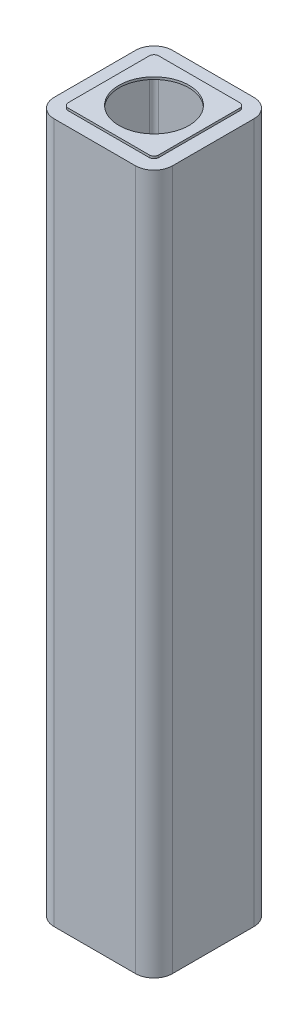
ISO-10303-21;
HEADER;
FILE_DESCRIPTION(('STEP AP214'),'2;1');
FILE_NAME('part.step','',(''),(''),'','','');
FILE_SCHEMA(('AUTOMOTIVE_DESIGN { 1 0 10303 214 1 1 1 1 }'));
ENDSEC;
DATA;
#1=APPLICATION_CONTEXT('core data for automotive mechanical design processes');
#2=APPLICATION_PROTOCOL_DEFINITION('international standard','automotive_design',2000,#1);
#3=PRODUCT_CONTEXT('',#1,'mechanical');
#4=PRODUCT('Part','Part','',(#3));
#5=PRODUCT_RELATED_PRODUCT_CATEGORY('part','',(#4));
#6=PRODUCT_DEFINITION_FORMATION('','',#4);
#7=PRODUCT_DEFINITION_CONTEXT('part definition',#1,'design');
#8=PRODUCT_DEFINITION('design','',#6,#7);
#9=PRODUCT_DEFINITION_SHAPE('','',#8);
#10=(LENGTH_UNIT() NAMED_UNIT(*) SI_UNIT(.MILLI.,.METRE.));
#11=(NAMED_UNIT(*) PLANE_ANGLE_UNIT() SI_UNIT($,.RADIAN.));
#12=(NAMED_UNIT(*) SI_UNIT($,.STERADIAN.) SOLID_ANGLE_UNIT());
#13=UNCERTAINTY_MEASURE_WITH_UNIT(LENGTH_MEASURE(1.E-05),#10,'distance_accuracy_value','');
#14=(GEOMETRIC_REPRESENTATION_CONTEXT(3) GLOBAL_UNCERTAINTY_ASSIGNED_CONTEXT((#13)) GLOBAL_UNIT_ASSIGNED_CONTEXT((#10,
#11,#12)) REPRESENTATION_CONTEXT('',''));
#15=CARTESIAN_POINT('',(0.,0.,0.));
#16=DIRECTION('',(0.,0.,1.));
#17=DIRECTION('',(1.,0.,0.));
#18=AXIS2_PLACEMENT_3D('',#15,#16,#17);
#19=CARTESIAN_POINT('',(8.7,150.5,-8.7));
#20=DIRECTION('',(0.,1.,0.));
#21=DIRECTION('',(0.,0.,1.));
#22=AXIS2_PLACEMENT_3D('',#19,#20,#21);
#23=PLANE('',#22);
#24=CARTESIAN_POINT('',(8.7,150.5,-8.7));
#25=DIRECTION('',(0.,1.,0.));
#26=DIRECTION('',(0.,0.,1.));
#27=AXIS2_PLACEMENT_3D('',#24,#25,#26);
#28=CIRCLE('',#27,1.00000000000001);
#29=CARTESIAN_POINT('',(9.7,150.5,-8.7));
#30=VERTEX_POINT('',#29);
#31=CARTESIAN_POINT('',(8.7,150.5,-9.7));
#32=VERTEX_POINT('',#31);
#33=EDGE_CURVE('E189',#30,#32,#28,.T.);
#34=ORIENTED_EDGE('',*,*,#33,.T.);
#35=DIRECTION('',(-1.,0.,0.));
#36=VECTOR('',#35,1.);
#37=CARTESIAN_POINT('',(8.7,150.5,-9.7));
#38=LINE('',#37,#36);
#39=CARTESIAN_POINT('',(-8.7,150.5,-9.7));
#40=VERTEX_POINT('',#39);
#41=EDGE_CURVE('E137',#32,#40,#38,.T.);
#42=ORIENTED_EDGE('',*,*,#41,.T.);
#43=CARTESIAN_POINT('',(-8.7,150.5,-8.7));
#44=DIRECTION('',(0.,1.,0.));
#45=DIRECTION('',(0.,0.,1.));
#46=AXIS2_PLACEMENT_3D('',#43,#44,#45);
#47=CIRCLE('',#46,1.);
#48=CARTESIAN_POINT('',(-9.7,150.5,-8.7));
#49=VERTEX_POINT('',#48);
#50=EDGE_CURVE('E204',#40,#49,#47,.T.);
#51=ORIENTED_EDGE('',*,*,#50,.T.);
#52=DIRECTION('',(0.,0.,1.));
#53=VECTOR('',#52,1.);
#54=CARTESIAN_POINT('',(-9.7,150.5,-8.7));
#55=LINE('',#54,#53);
#56=CARTESIAN_POINT('',(-9.7,150.5,8.7));
#57=VERTEX_POINT('',#56);
#58=EDGE_CURVE('E217',#49,#57,#55,.T.);
#59=ORIENTED_EDGE('',*,*,#58,.T.);
#60=CARTESIAN_POINT('',(-8.7,150.5,8.7));
#61=DIRECTION('',(0.,1.,0.));
#62=DIRECTION('',(0.,0.,1.));
#63=AXIS2_PLACEMENT_3D('',#60,#61,#62);
#64=CIRCLE('',#63,1.);
#65=CARTESIAN_POINT('',(-8.7,150.5,9.7));
#66=VERTEX_POINT('',#65);
#67=EDGE_CURVE('E156',#57,#66,#64,.T.);
#68=ORIENTED_EDGE('',*,*,#67,.T.);
#69=DIRECTION('',(1.,0.,0.));
#70=VECTOR('',#69,1.);
#71=CARTESIAN_POINT('',(-8.7,150.5,9.7));
#72=LINE('',#71,#70);
#73=CARTESIAN_POINT('',(8.7,150.5,9.7));
#74=VERTEX_POINT('',#73);
#75=EDGE_CURVE('E150',#66,#74,#72,.T.);
#76=ORIENTED_EDGE('',*,*,#75,.T.);
#77=CARTESIAN_POINT('',(8.7,150.5,8.7));
#78=DIRECTION('',(0.,1.,0.));
#79=DIRECTION('',(0.,0.,1.));
#80=AXIS2_PLACEMENT_3D('',#77,#78,#79);
#81=CIRCLE('',#80,1.);
#82=CARTESIAN_POINT('',(9.7,150.5,8.7));
#83=VERTEX_POINT('',#82);
#84=EDGE_CURVE('E154',#74,#83,#81,.T.);
#85=ORIENTED_EDGE('',*,*,#84,.T.);
#86=DIRECTION('',(0.,0.,-1.));
#87=VECTOR('',#86,1.);
#88=CARTESIAN_POINT('',(9.7,150.5,8.7));
#89=LINE('',#88,#87);
#90=EDGE_CURVE('E94',#83,#30,#89,.T.);
#91=ORIENTED_EDGE('',*,*,#90,.T.);
#92=EDGE_LOOP('',(#34,#42,#51,#59,#68,#76,#85,#91));
#93=FACE_BOUND('',#92,.T.);
#94=CARTESIAN_POINT('',(0.,150.5,0.));
#95=DIRECTION('',(0.,1.,0.));
#96=DIRECTION('',(0.,0.,1.));
#97=AXIS2_PLACEMENT_3D('',#94,#95,#96);
#98=CIRCLE('',#97,7.5);
#99=CARTESIAN_POINT('',(0.,150.5,7.50000000000001));
#100=VERTEX_POINT('',#99);
#101=EDGE_CURVE('E178',#100,#100,#98,.T.);
#102=ORIENTED_EDGE('',*,*,#101,.F.);
#103=EDGE_LOOP('',(#102));
#104=FACE_BOUND('',#103,.T.);
#105=ADVANCED_FACE('F77',(#93,#104),#23,.T.);
#106=CARTESIAN_POINT('',(8.7,150.,-8.7));
#107=DIRECTION('',(0.,1.,0.));
#108=DIRECTION('',(0.,0.,1.));
#109=AXIS2_PLACEMENT_3D('',#106,#107,#108);
#110=PLANE('',#109);
#111=CARTESIAN_POINT('',(8.7,150.,-8.7));
#112=DIRECTION('',(0.,1.,0.));
#113=DIRECTION('',(0.,0.,1.));
#114=AXIS2_PLACEMENT_3D('',#111,#112,#113);
#115=CIRCLE('',#114,1.00000000000001);
#116=CARTESIAN_POINT('',(9.7,150.,-8.7));
#117=VERTEX_POINT('',#116);
#118=CARTESIAN_POINT('',(8.7,150.,-9.7));
#119=VERTEX_POINT('',#118);
#120=EDGE_CURVE('E174',#117,#119,#115,.T.);
#121=ORIENTED_EDGE('',*,*,#120,.F.);
#122=DIRECTION('',(0.,0.,-1.));
#123=VECTOR('',#122,1.);
#124=CARTESIAN_POINT('',(9.7,150.,8.7));
#125=LINE('',#124,#123);
#126=CARTESIAN_POINT('',(9.7,150.,8.7));
#127=VERTEX_POINT('',#126);
#128=EDGE_CURVE('E129',#127,#117,#125,.T.);
#129=ORIENTED_EDGE('',*,*,#128,.F.);
#130=CARTESIAN_POINT('',(8.7,150.,8.7));
#131=DIRECTION('',(0.,1.,0.));
#132=DIRECTION('',(0.,0.,1.));
#133=AXIS2_PLACEMENT_3D('',#130,#131,#132);
#134=CIRCLE('',#133,1.);
#135=CARTESIAN_POINT('',(8.7,150.,9.7));
#136=VERTEX_POINT('',#135);
#137=EDGE_CURVE('E123',#136,#127,#134,.T.);
#138=ORIENTED_EDGE('',*,*,#137,.F.);
#139=DIRECTION('',(1.,0.,0.));
#140=VECTOR('',#139,1.);
#141=CARTESIAN_POINT('',(-8.7,150.,9.7));
#142=LINE('',#141,#140);
#143=CARTESIAN_POINT('',(-8.7,150.,9.7));
#144=VERTEX_POINT('',#143);
#145=EDGE_CURVE('E164',#144,#136,#142,.T.);
#146=ORIENTED_EDGE('',*,*,#145,.F.);
#147=CARTESIAN_POINT('',(-8.7,150.,8.7));
#148=DIRECTION('',(0.,1.,0.));
#149=DIRECTION('',(0.,0.,1.));
#150=AXIS2_PLACEMENT_3D('',#147,#148,#149);
#151=CIRCLE('',#150,1.);
#152=CARTESIAN_POINT('',(-9.7,150.,8.7));
#153=VERTEX_POINT('',#152);
#154=EDGE_CURVE('E184',#153,#144,#151,.T.);
#155=ORIENTED_EDGE('',*,*,#154,.F.);
#156=DIRECTION('',(0.,0.,1.));
#157=VECTOR('',#156,1.);
#158=CARTESIAN_POINT('',(-9.7,150.,-8.7));
#159=LINE('',#158,#157);
#160=CARTESIAN_POINT('',(-9.7,150.,-8.7));
#161=VERTEX_POINT('',#160);
#162=EDGE_CURVE('E182',#161,#153,#159,.T.);
#163=ORIENTED_EDGE('',*,*,#162,.F.);
#164=CARTESIAN_POINT('',(-8.7,150.,-8.7));
#165=DIRECTION('',(0.,1.,0.));
#166=DIRECTION('',(0.,0.,1.));
#167=AXIS2_PLACEMENT_3D('',#164,#165,#166);
#168=CIRCLE('',#167,1.);
#169=CARTESIAN_POINT('',(-8.7,150.,-9.7));
#170=VERTEX_POINT('',#169);
#171=EDGE_CURVE('E180',#170,#161,#168,.T.);
#172=ORIENTED_EDGE('',*,*,#171,.F.);
#173=DIRECTION('',(-1.,0.,0.));
#174=VECTOR('',#173,1.);
#175=CARTESIAN_POINT('',(8.7,150.,-9.7));
#176=LINE('',#175,#174);
#177=EDGE_CURVE('E177',#119,#170,#176,.T.);
#178=ORIENTED_EDGE('',*,*,#177,.F.);
#179=EDGE_LOOP('',(#121,#129,#138,#146,#155,#163,#172,#178));
#180=FACE_BOUND('',#179,.T.);
#181=CARTESIAN_POINT('',(0.,150.,0.));
#182=DIRECTION('',(0.,1.,0.));
#183=DIRECTION('',(0.,0.,1.));
#184=AXIS2_PLACEMENT_3D('',#181,#182,#183);
#185=CIRCLE('',#184,7.5);
#186=CARTESIAN_POINT('',(0.,150.,7.50000000000001));
#187=VERTEX_POINT('',#186);
#188=EDGE_CURVE('E223',#187,#187,#185,.T.);
#189=ORIENTED_EDGE('',*,*,#188,.T.);
#190=EDGE_LOOP('',(#189));
#191=FACE_BOUND('',#190,.T.);
#192=ADVANCED_FACE('F208',(#180,#191),#110,.F.);
#193=CARTESIAN_POINT('',(8.7,150.5,-8.7));
#194=DIRECTION('',(0.,-1.,0.));
#195=DIRECTION('',(0.,0.,-1.));
#196=AXIS2_PLACEMENT_3D('',#193,#194,#195);
#197=CYLINDRICAL_SURFACE('',#196,1.00000000000001);
#198=ORIENTED_EDGE('',*,*,#120,.T.);
#199=DIRECTION('',(0.,-1.,0.));
#200=VECTOR('',#199,1.);
#201=CARTESIAN_POINT('',(8.7,150.5,-9.7));
#202=LINE('',#201,#200);
#203=EDGE_CURVE('E13',#32,#119,#202,.T.);
#204=ORIENTED_EDGE('',*,*,#203,.F.);
#205=ORIENTED_EDGE('',*,*,#33,.F.);
#206=DIRECTION('',(0.,-1.,0.));
#207=VECTOR('',#206,1.);
#208=CARTESIAN_POINT('',(9.7,150.5,-8.7));
#209=LINE('',#208,#207);
#210=EDGE_CURVE('E170',#30,#117,#209,.T.);
#211=ORIENTED_EDGE('',*,*,#210,.T.);
#212=EDGE_LOOP('',(#198,#204,#205,#211));
#213=FACE_BOUND('',#212,.T.);
#214=ADVANCED_FACE('F79',(#213),#197,.T.);
#215=CARTESIAN_POINT('',(8.7,150.5,-9.7));
#216=DIRECTION('',(0.,0.,1.));
#217=DIRECTION('',(0.,-1.,0.));
#218=AXIS2_PLACEMENT_3D('',#215,#216,#217);
#219=PLANE('',#218);
#220=ORIENTED_EDGE('',*,*,#177,.T.);
#221=DIRECTION('',(0.,-1.,0.));
#222=VECTOR('',#221,1.);
#223=CARTESIAN_POINT('',(-8.7,150.5,-9.7));
#224=LINE('',#223,#222);
#225=EDGE_CURVE('E86',#40,#170,#224,.T.);
#226=ORIENTED_EDGE('',*,*,#225,.F.);
#227=ORIENTED_EDGE('',*,*,#41,.F.);
#228=ORIENTED_EDGE('',*,*,#203,.T.);
#229=EDGE_LOOP('',(#220,#226,#227,#228));
#230=FACE_BOUND('',#229,.T.);
#231=ADVANCED_FACE('F251',(#230),#219,.F.);
#232=CARTESIAN_POINT('',(-8.7,150.5,-8.7));
#233=DIRECTION('',(0.,-1.,0.));
#234=DIRECTION('',(0.,0.,-1.));
#235=AXIS2_PLACEMENT_3D('',#232,#233,#234);
#236=CYLINDRICAL_SURFACE('',#235,1.);
#237=ORIENTED_EDGE('',*,*,#171,.T.);
#238=DIRECTION('',(0.,-1.,0.));
#239=VECTOR('',#238,1.);
#240=CARTESIAN_POINT('',(-9.7,150.5,-8.7));
#241=LINE('',#240,#239);
#242=EDGE_CURVE('E196',#49,#161,#241,.T.);
#243=ORIENTED_EDGE('',*,*,#242,.F.);
#244=ORIENTED_EDGE('',*,*,#50,.F.);
#245=ORIENTED_EDGE('',*,*,#225,.T.);
#246=EDGE_LOOP('',(#237,#243,#244,#245));
#247=FACE_BOUND('',#246,.T.);
#248=ADVANCED_FACE('F202',(#247),#236,.T.);
#249=CARTESIAN_POINT('',(-9.7,150.5,-8.7));
#250=DIRECTION('',(1.,0.,0.));
#251=DIRECTION('',(0.,0.,-1.));
#252=AXIS2_PLACEMENT_3D('',#249,#250,#251);
#253=PLANE('',#252);
#254=ORIENTED_EDGE('',*,*,#162,.T.);
#255=DIRECTION('',(0.,-1.,0.));
#256=VECTOR('',#255,1.);
#257=CARTESIAN_POINT('',(-9.7,150.5,8.7));
#258=LINE('',#257,#256);
#259=EDGE_CURVE('E193',#57,#153,#258,.T.);
#260=ORIENTED_EDGE('',*,*,#259,.F.);
#261=ORIENTED_EDGE('',*,*,#58,.F.);
#262=ORIENTED_EDGE('',*,*,#242,.T.);
#263=EDGE_LOOP('',(#254,#260,#261,#262));
#264=FACE_BOUND('',#263,.T.);
#265=ADVANCED_FACE('F213',(#264),#253,.F.);
#266=CARTESIAN_POINT('',(-8.7,150.5,8.7));
#267=DIRECTION('',(0.,-1.,0.));
#268=DIRECTION('',(0.,0.,-1.));
#269=AXIS2_PLACEMENT_3D('',#266,#267,#268);
#270=CYLINDRICAL_SURFACE('',#269,1.);
#271=ORIENTED_EDGE('',*,*,#154,.T.);
#272=DIRECTION('',(0.,-1.,0.));
#273=VECTOR('',#272,1.);
#274=CARTESIAN_POINT('',(-8.7,150.5,9.7));
#275=LINE('',#274,#273);
#276=EDGE_CURVE('E165',#66,#144,#275,.T.);
#277=ORIENTED_EDGE('',*,*,#276,.F.);
#278=ORIENTED_EDGE('',*,*,#67,.F.);
#279=ORIENTED_EDGE('',*,*,#259,.T.);
#280=EDGE_LOOP('',(#271,#277,#278,#279));
#281=FACE_BOUND('',#280,.T.);
#282=ADVANCED_FACE('F216',(#281),#270,.T.);
#283=CARTESIAN_POINT('',(-8.7,150.5,9.7));
#284=DIRECTION('',(0.,0.,-1.));
#285=DIRECTION('',(-1.,0.,0.));
#286=AXIS2_PLACEMENT_3D('',#283,#284,#285);
#287=PLANE('',#286);
#288=ORIENTED_EDGE('',*,*,#145,.T.);
#289=DIRECTION('',(0.,-1.,0.));
#290=VECTOR('',#289,1.);
#291=CARTESIAN_POINT('',(8.7,150.5,9.7));
#292=LINE('',#291,#290);
#293=EDGE_CURVE('E161',#74,#136,#292,.T.);
#294=ORIENTED_EDGE('',*,*,#293,.F.);
#295=ORIENTED_EDGE('',*,*,#75,.F.);
#296=ORIENTED_EDGE('',*,*,#276,.T.);
#297=EDGE_LOOP('',(#288,#294,#295,#296));
#298=FACE_BOUND('',#297,.T.);
#299=ADVANCED_FACE('F162',(#298),#287,.F.);
#300=CARTESIAN_POINT('',(8.7,150.5,8.7));
#301=DIRECTION('',(0.,-1.,0.));
#302=DIRECTION('',(0.,0.,-1.));
#303=AXIS2_PLACEMENT_3D('',#300,#301,#302);
#304=CYLINDRICAL_SURFACE('',#303,1.);
#305=ORIENTED_EDGE('',*,*,#137,.T.);
#306=DIRECTION('',(0.,-1.,0.));
#307=VECTOR('',#306,1.);
#308=CARTESIAN_POINT('',(9.7,150.5,8.7));
#309=LINE('',#308,#307);
#310=EDGE_CURVE('E166',#83,#127,#309,.T.);
#311=ORIENTED_EDGE('',*,*,#310,.F.);
#312=ORIENTED_EDGE('',*,*,#84,.F.);
#313=ORIENTED_EDGE('',*,*,#293,.T.);
#314=EDGE_LOOP('',(#305,#311,#312,#313));
#315=FACE_BOUND('',#314,.T.);
#316=ADVANCED_FACE('F168',(#315),#304,.T.);
#317=CARTESIAN_POINT('',(9.7,150.5,8.7));
#318=DIRECTION('',(-1.,0.,0.));
#319=DIRECTION('',(0.,0.,1.));
#320=AXIS2_PLACEMENT_3D('',#317,#318,#319);
#321=PLANE('',#320);
#322=ORIENTED_EDGE('',*,*,#128,.T.);
#323=ORIENTED_EDGE('',*,*,#210,.F.);
#324=ORIENTED_EDGE('',*,*,#90,.F.);
#325=ORIENTED_EDGE('',*,*,#310,.T.);
#326=EDGE_LOOP('',(#322,#323,#324,#325));
#327=FACE_BOUND('',#326,.T.);
#328=ADVANCED_FACE('F239',(#327),#321,.F.);
#329=CARTESIAN_POINT('',(0.,150.5,0.));
#330=DIRECTION('',(0.,-1.,0.));
#331=DIRECTION('',(0.,0.,-1.));
#332=AXIS2_PLACEMENT_3D('',#329,#330,#331);
#333=CYLINDRICAL_SURFACE('',#332,7.5);
#334=ORIENTED_EDGE('',*,*,#101,.T.);
#335=EDGE_LOOP('',(#334));
#336=FACE_BOUND('',#335,.T.);
#337=ORIENTED_EDGE('',*,*,#188,.F.);
#338=EDGE_LOOP('',(#337));
#339=FACE_BOUND('',#338,.T.);
#340=ADVANCED_FACE('F229',(#336,#339),#333,.F.);
#341=CLOSED_SHELL('',(#105,#192,#214,#231,#248,#265,#282,#299,#316,#328,#340));
#342=MANIFOLD_SOLID_BREP('B2',#341);
#343=CARTESIAN_POINT('',(8.7,150.,-8.7));
#344=DIRECTION('',(0.,-1.,0.));
#345=DIRECTION('',(0.,0.,-1.));
#346=AXIS2_PLACEMENT_3D('',#343,#344,#345);
#347=CYLINDRICAL_SURFACE('',#346,4.);
#348=CARTESIAN_POINT('',(8.7,0.,-8.7));
#349=DIRECTION('',(0.,1.,0.));
#350=DIRECTION('',(0.,0.,1.));
#351=AXIS2_PLACEMENT_3D('',#348,#349,#350);
#352=CIRCLE('',#351,4.);
#353=CARTESIAN_POINT('',(12.7,0.,-8.69999999999999));
#354=VERTEX_POINT('',#353);
#355=CARTESIAN_POINT('',(8.7,0.,-12.7));
#356=VERTEX_POINT('',#355);
#357=EDGE_CURVE('E498',#354,#356,#352,.T.);
#358=ORIENTED_EDGE('',*,*,#357,.T.);
#359=DIRECTION('',(0.,-1.,0.));
#360=VECTOR('',#359,1.);
#361=CARTESIAN_POINT('',(8.7,150.,-12.7));
#362=LINE('',#361,#360);
#363=CARTESIAN_POINT('',(8.7,150.,-12.7));
#364=VERTEX_POINT('',#363);
#365=EDGE_CURVE('E75',#364,#356,#362,.T.);
#366=ORIENTED_EDGE('',*,*,#365,.F.);
#367=CARTESIAN_POINT('',(8.7,150.,-8.7));
#368=DIRECTION('',(0.,1.,0.));
#369=DIRECTION('',(0.,0.,1.));
#370=AXIS2_PLACEMENT_3D('',#367,#368,#369);
#371=CIRCLE('',#370,4.);
#372=CARTESIAN_POINT('',(12.7,150.,-8.69999999999999));
#373=VERTEX_POINT('',#372);
#374=EDGE_CURVE('E576',#373,#364,#371,.T.);
#375=ORIENTED_EDGE('',*,*,#374,.F.);
#376=DIRECTION('',(0.,-1.,0.));
#377=VECTOR('',#376,1.);
#378=CARTESIAN_POINT('',(12.7,150.,-8.69999999999999));
#379=LINE('',#378,#377);
#380=EDGE_CURVE('E513',#373,#354,#379,.T.);
#381=ORIENTED_EDGE('',*,*,#380,.T.);
#382=EDGE_LOOP('',(#358,#366,#375,#381));
#383=FACE_BOUND('',#382,.T.);
#384=ADVANCED_FACE('F326',(#383),#347,.T.);
#385=CARTESIAN_POINT('',(8.7,150.,-12.7));
#386=DIRECTION('',(0.,0.,1.));
#387=DIRECTION('',(1.,0.,0.));
#388=AXIS2_PLACEMENT_3D('',#385,#386,#387);
#389=PLANE('',#388);
#390=DIRECTION('',(-1.,0.,0.));
#391=VECTOR('',#390,1.);
#392=CARTESIAN_POINT('',(8.7,0.,-12.7));
#393=LINE('',#392,#391);
#394=CARTESIAN_POINT('',(-8.7,0.,-12.7));
#395=VERTEX_POINT('',#394);
#396=EDGE_CURVE('E501',#356,#395,#393,.T.);
#397=ORIENTED_EDGE('',*,*,#396,.T.);
#398=DIRECTION('',(0.,-1.,0.));
#399=VECTOR('',#398,1.);
#400=CARTESIAN_POINT('',(-8.7,150.,-12.7));
#401=LINE('',#400,#399);
#402=CARTESIAN_POINT('',(-8.7,150.,-12.7));
#403=VERTEX_POINT('',#402);
#404=EDGE_CURVE('E336',#403,#395,#401,.T.);
#405=ORIENTED_EDGE('',*,*,#404,.F.);
#406=DIRECTION('',(-1.,0.,0.));
#407=VECTOR('',#406,1.);
#408=CARTESIAN_POINT('',(8.7,150.,-12.7));
#409=LINE('',#408,#407);
#410=EDGE_CURVE('E578',#364,#403,#409,.T.);
#411=ORIENTED_EDGE('',*,*,#410,.F.);
#412=ORIENTED_EDGE('',*,*,#365,.T.);
#413=EDGE_LOOP('',(#397,#405,#411,#412));
#414=FACE_BOUND('',#413,.T.);
#415=ADVANCED_FACE('F613',(#414),#389,.F.);
#416=CARTESIAN_POINT('',(-8.7,150.,-8.7));
#417=DIRECTION('',(0.,-1.,0.));
#418=DIRECTION('',(0.,0.,-1.));
#419=AXIS2_PLACEMENT_3D('',#416,#417,#418);
#420=CYLINDRICAL_SURFACE('',#419,4.);
#421=CARTESIAN_POINT('',(-8.7,0.,-8.7));
#422=DIRECTION('',(0.,1.,0.));
#423=DIRECTION('',(0.,0.,1.));
#424=AXIS2_PLACEMENT_3D('',#421,#422,#423);
#425=CIRCLE('',#424,4.);
#426=CARTESIAN_POINT('',(-12.7,0.,-8.69999999999999));
#427=VERTEX_POINT('',#426);
#428=EDGE_CURVE('E503',#395,#427,#425,.T.);
#429=ORIENTED_EDGE('',*,*,#428,.T.);
#430=DIRECTION('',(0.,-1.,0.));
#431=VECTOR('',#430,1.);
#432=CARTESIAN_POINT('',(-12.7,150.,-8.69999999999999));
#433=LINE('',#432,#431);
#434=CARTESIAN_POINT('',(-12.7,150.,-8.69999999999999));
#435=VERTEX_POINT('',#434);
#436=EDGE_CURVE('E520',#435,#427,#433,.T.);
#437=ORIENTED_EDGE('',*,*,#436,.F.);
#438=CARTESIAN_POINT('',(-8.7,150.,-8.7));
#439=DIRECTION('',(0.,1.,0.));
#440=DIRECTION('',(0.,0.,1.));
#441=AXIS2_PLACEMENT_3D('',#438,#439,#440);
#442=CIRCLE('',#441,4.);
#443=EDGE_CURVE('E580',#403,#435,#442,.T.);
#444=ORIENTED_EDGE('',*,*,#443,.F.);
#445=ORIENTED_EDGE('',*,*,#404,.T.);
#446=EDGE_LOOP('',(#429,#437,#444,#445));
#447=FACE_BOUND('',#446,.T.);
#448=ADVANCED_FACE('F618',(#447),#420,.T.);
#449=CARTESIAN_POINT('',(-12.7,150.,8.69999999999999));
#450=DIRECTION('',(1.,0.,0.));
#451=DIRECTION('',(0.,0.,-1.));
#452=AXIS2_PLACEMENT_3D('',#449,#450,#451);
#453=PLANE('',#452);
#454=DIRECTION('',(0.,0.,1.));
#455=VECTOR('',#454,1.);
#456=CARTESIAN_POINT('',(-12.7,0.,8.69999999999999));
#457=LINE('',#456,#455);
#458=CARTESIAN_POINT('',(-12.7,0.,8.69999999999999));
#459=VERTEX_POINT('',#458);
#460=EDGE_CURVE('E505',#427,#459,#457,.T.);
#461=ORIENTED_EDGE('',*,*,#460,.T.);
#462=DIRECTION('',(0.,-1.,0.));
#463=VECTOR('',#462,1.);
#464=CARTESIAN_POINT('',(-12.7,150.,8.69999999999999));
#465=LINE('',#464,#463);
#466=CARTESIAN_POINT('',(-12.7,150.,8.69999999999999));
#467=VERTEX_POINT('',#466);
#468=EDGE_CURVE('E517',#467,#459,#465,.T.);
#469=ORIENTED_EDGE('',*,*,#468,.F.);
#470=DIRECTION('',(0.,0.,1.));
#471=VECTOR('',#470,1.);
#472=CARTESIAN_POINT('',(-12.7,150.,8.69999999999999));
#473=LINE('',#472,#471);
#474=EDGE_CURVE('E582',#435,#467,#473,.T.);
#475=ORIENTED_EDGE('',*,*,#474,.F.);
#476=ORIENTED_EDGE('',*,*,#436,.T.);
#477=EDGE_LOOP('',(#461,#469,#475,#476));
#478=FACE_BOUND('',#477,.T.);
#479=ADVANCED_FACE('F588',(#478),#453,.F.);
#480=CARTESIAN_POINT('',(-8.7,150.,8.7));
#481=DIRECTION('',(0.,-1.,0.));
#482=DIRECTION('',(0.,0.,-1.));
#483=AXIS2_PLACEMENT_3D('',#480,#481,#482);
#484=CYLINDRICAL_SURFACE('',#483,4.);
#485=CARTESIAN_POINT('',(-8.7,0.,8.7));
#486=DIRECTION('',(0.,1.,0.));
#487=DIRECTION('',(0.,0.,1.));
#488=AXIS2_PLACEMENT_3D('',#485,#486,#487);
#489=CIRCLE('',#488,4.);
#490=CARTESIAN_POINT('',(-8.7,0.,12.7));
#491=VERTEX_POINT('',#490);
#492=EDGE_CURVE('E507',#459,#491,#489,.T.);
#493=ORIENTED_EDGE('',*,*,#492,.T.);
#494=DIRECTION('',(0.,-1.,0.));
#495=VECTOR('',#494,1.);
#496=CARTESIAN_POINT('',(-8.7,150.,12.7));
#497=LINE('',#496,#495);
#498=CARTESIAN_POINT('',(-8.7,150.,12.7));
#499=VERTEX_POINT('',#498);
#500=EDGE_CURVE('E465',#499,#491,#497,.T.);
#501=ORIENTED_EDGE('',*,*,#500,.F.);
#502=CARTESIAN_POINT('',(-8.7,150.,8.7));
#503=DIRECTION('',(0.,1.,0.));
#504=DIRECTION('',(0.,0.,1.));
#505=AXIS2_PLACEMENT_3D('',#502,#503,#504);
#506=CIRCLE('',#505,4.);
#507=EDGE_CURVE('E456',#467,#499,#506,.T.);
#508=ORIENTED_EDGE('',*,*,#507,.F.);
#509=ORIENTED_EDGE('',*,*,#468,.T.);
#510=EDGE_LOOP('',(#493,#501,#508,#509));
#511=FACE_BOUND('',#510,.T.);
#512=ADVANCED_FACE('F592',(#511),#484,.T.);
#513=CARTESIAN_POINT('',(-8.7,150.,12.7));
#514=DIRECTION('',(0.,0.,-1.));
#515=DIRECTION('',(-1.,0.,0.));
#516=AXIS2_PLACEMENT_3D('',#513,#514,#515);
#517=PLANE('',#516);
#518=DIRECTION('',(1.,0.,0.));
#519=VECTOR('',#518,1.);
#520=CARTESIAN_POINT('',(-8.7,0.,12.7));
#521=LINE('',#520,#519);
#522=CARTESIAN_POINT('',(8.7,0.,12.7));
#523=VERTEX_POINT('',#522);
#524=EDGE_CURVE('E464',#491,#523,#521,.T.);
#525=ORIENTED_EDGE('',*,*,#524,.T.);
#526=DIRECTION('',(0.,-1.,0.));
#527=VECTOR('',#526,1.);
#528=CARTESIAN_POINT('',(8.7,150.,12.7));
#529=LINE('',#528,#527);
#530=CARTESIAN_POINT('',(8.7,150.,12.7));
#531=VERTEX_POINT('',#530);
#532=EDGE_CURVE('E461',#531,#523,#529,.T.);
#533=ORIENTED_EDGE('',*,*,#532,.F.);
#534=DIRECTION('',(1.,0.,0.));
#535=VECTOR('',#534,1.);
#536=CARTESIAN_POINT('',(-8.7,150.,12.7));
#537=LINE('',#536,#535);
#538=EDGE_CURVE('E450',#499,#531,#537,.T.);
#539=ORIENTED_EDGE('',*,*,#538,.F.);
#540=ORIENTED_EDGE('',*,*,#500,.T.);
#541=EDGE_LOOP('',(#525,#533,#539,#540));
#542=FACE_BOUND('',#541,.T.);
#543=ADVANCED_FACE('F462',(#542),#517,.F.);
#544=CARTESIAN_POINT('',(8.7,150.,8.7));
#545=DIRECTION('',(0.,-1.,0.));
#546=DIRECTION('',(0.,0.,-1.));
#547=AXIS2_PLACEMENT_3D('',#544,#545,#546);
#548=CYLINDRICAL_SURFACE('',#547,4.);
#549=CARTESIAN_POINT('',(8.7,0.,8.7));
#550=DIRECTION('',(0.,1.,0.));
#551=DIRECTION('',(0.,0.,1.));
#552=AXIS2_PLACEMENT_3D('',#549,#550,#551);
#553=CIRCLE('',#552,4.);
#554=CARTESIAN_POINT('',(12.7,0.,8.69999999999999));
#555=VERTEX_POINT('',#554);
#556=EDGE_CURVE('E398',#523,#555,#553,.T.);
#557=ORIENTED_EDGE('',*,*,#556,.T.);
#558=DIRECTION('',(0.,-1.,0.));
#559=VECTOR('',#558,1.);
#560=CARTESIAN_POINT('',(12.7,150.,8.69999999999999));
#561=LINE('',#560,#559);
#562=CARTESIAN_POINT('',(12.7,150.,8.69999999999999));
#563=VERTEX_POINT('',#562);
#564=EDGE_CURVE('E466',#563,#555,#561,.T.);
#565=ORIENTED_EDGE('',*,*,#564,.F.);
#566=CARTESIAN_POINT('',(8.7,150.,8.7));
#567=DIRECTION('',(0.,1.,0.));
#568=DIRECTION('',(0.,0.,1.));
#569=AXIS2_PLACEMENT_3D('',#566,#567,#568);
#570=CIRCLE('',#569,4.);
#571=EDGE_CURVE('E454',#531,#563,#570,.T.);
#572=ORIENTED_EDGE('',*,*,#571,.F.);
#573=ORIENTED_EDGE('',*,*,#532,.T.);
#574=EDGE_LOOP('',(#557,#565,#572,#573));
#575=FACE_BOUND('',#574,.T.);
#576=ADVANCED_FACE('F468',(#575),#548,.T.);
#577=CARTESIAN_POINT('',(-8.7,150.,-8.7));
#578=DIRECTION('',(0.,-1.,0.));
#579=DIRECTION('',(0.,0.,-1.));
#580=AXIS2_PLACEMENT_3D('',#577,#578,#579);
#581=CYLINDRICAL_SURFACE('',#580,1.);
#582=CARTESIAN_POINT('',(-8.7,0.,-8.7));
#583=DIRECTION('',(0.,1.,0.));
#584=DIRECTION('',(0.,0.,1.));
#585=AXIS2_PLACEMENT_3D('',#582,#583,#584);
#586=CIRCLE('',#585,1.);
#587=CARTESIAN_POINT('',(-8.7,0.,-9.7));
#588=VERTEX_POINT('',#587);
#589=CARTESIAN_POINT('',(-9.7,0.,-8.7));
#590=VERTEX_POINT('',#589);
#591=EDGE_CURVE('E474',#588,#590,#586,.T.);
#592=ORIENTED_EDGE('',*,*,#591,.F.);
#593=DIRECTION('',(0.,-1.,0.));
#594=VECTOR('',#593,1.);
#595=CARTESIAN_POINT('',(-8.7,150.,-9.7));
#596=LINE('',#595,#594);
#597=CARTESIAN_POINT('',(-8.7,150.,-9.7));
#598=VERTEX_POINT('',#597);
#599=EDGE_CURVE('E330',#598,#588,#596,.T.);
#600=ORIENTED_EDGE('',*,*,#599,.F.);
#601=CARTESIAN_POINT('',(-8.7,150.,-8.7));
#602=DIRECTION('',(0.,1.,0.));
#603=DIRECTION('',(0.,0.,1.));
#604=AXIS2_PLACEMENT_3D('',#601,#602,#603);
#605=CIRCLE('',#604,1.);
#606=CARTESIAN_POINT('',(-9.7,150.,-8.7));
#607=VERTEX_POINT('',#606);
#608=EDGE_CURVE('E512',#598,#607,#605,.T.);
#609=ORIENTED_EDGE('',*,*,#608,.T.);
#610=DIRECTION('',(0.,-1.,0.));
#611=VECTOR('',#610,1.);
#612=CARTESIAN_POINT('',(-9.7,150.,-8.7));
#613=LINE('',#612,#611);
#614=EDGE_CURVE('E470',#607,#590,#613,.T.);
#615=ORIENTED_EDGE('',*,*,#614,.T.);
#616=EDGE_LOOP('',(#592,#600,#609,#615));
#617=FACE_BOUND('',#616,.T.);
#618=ADVANCED_FACE('F328',(#617),#581,.F.);
#619=CARTESIAN_POINT('',(8.7,150.,-9.7));
#620=DIRECTION('',(0.,0.,1.));
#621=DIRECTION('',(1.,0.,0.));
#622=AXIS2_PLACEMENT_3D('',#619,#620,#621);
#623=PLANE('',#622);
#624=DIRECTION('',(-1.,0.,0.));
#625=VECTOR('',#624,1.);
#626=CARTESIAN_POINT('',(8.7,0.,-9.7));
#627=LINE('',#626,#625);
#628=CARTESIAN_POINT('',(8.7,0.,-9.7));
#629=VERTEX_POINT('',#628);
#630=EDGE_CURVE('E477',#629,#588,#627,.T.);
#631=ORIENTED_EDGE('',*,*,#630,.F.);
#632=DIRECTION('',(0.,-1.,0.));
#633=VECTOR('',#632,1.);
#634=CARTESIAN_POINT('',(8.7,150.,-9.7));
#635=LINE('',#634,#633);
#636=CARTESIAN_POINT('',(8.7,150.,-9.7));
#637=VERTEX_POINT('',#636);
#638=EDGE_CURVE('E535',#637,#629,#635,.T.);
#639=ORIENTED_EDGE('',*,*,#638,.F.);
#640=DIRECTION('',(-1.,0.,0.));
#641=VECTOR('',#640,1.);
#642=CARTESIAN_POINT('',(8.7,150.,-9.7));
#643=LINE('',#642,#641);
#644=EDGE_CURVE('E544',#637,#598,#643,.T.);
#645=ORIENTED_EDGE('',*,*,#644,.T.);
#646=ORIENTED_EDGE('',*,*,#599,.T.);
#647=EDGE_LOOP('',(#631,#639,#645,#646));
#648=FACE_BOUND('',#647,.T.);
#649=ADVANCED_FACE('F542',(#648),#623,.T.);
#650=CARTESIAN_POINT('',(8.7,150.,-8.7));
#651=DIRECTION('',(0.,-1.,0.));
#652=DIRECTION('',(0.,0.,-1.));
#653=AXIS2_PLACEMENT_3D('',#650,#651,#652);
#654=CYLINDRICAL_SURFACE('',#653,1.);
#655=CARTESIAN_POINT('',(8.7,0.,-8.7));
#656=DIRECTION('',(0.,1.,0.));
#657=DIRECTION('',(0.,0.,1.));
#658=AXIS2_PLACEMENT_3D('',#655,#656,#657);
#659=CIRCLE('',#658,1.);
#660=CARTESIAN_POINT('',(9.7,0.,-8.7));
#661=VERTEX_POINT('',#660);
#662=EDGE_CURVE('E480',#661,#629,#659,.T.);
#663=ORIENTED_EDGE('',*,*,#662,.F.);
#664=DIRECTION('',(0.,-1.,0.));
#665=VECTOR('',#664,1.);
#666=CARTESIAN_POINT('',(9.7,150.,-8.7));
#667=LINE('',#666,#665);
#668=CARTESIAN_POINT('',(9.7,150.,-8.7));
#669=VERTEX_POINT('',#668);
#670=EDGE_CURVE('E534',#669,#661,#667,.T.);
#671=ORIENTED_EDGE('',*,*,#670,.F.);
#672=CARTESIAN_POINT('',(8.7,150.,-8.7));
#673=DIRECTION('',(0.,1.,0.));
#674=DIRECTION('',(0.,0.,1.));
#675=AXIS2_PLACEMENT_3D('',#672,#673,#674);
#676=CIRCLE('',#675,1.);
#677=EDGE_CURVE('E552',#669,#637,#676,.T.);
#678=ORIENTED_EDGE('',*,*,#677,.T.);
#679=ORIENTED_EDGE('',*,*,#638,.T.);
#680=EDGE_LOOP('',(#663,#671,#678,#679));
#681=FACE_BOUND('',#680,.T.);
#682=ADVANCED_FACE('F550',(#681),#654,.F.);
#683=CARTESIAN_POINT('',(9.7,150.,-8.7));
#684=DIRECTION('',(-1.,0.,0.));
#685=DIRECTION('',(0.,0.,1.));
#686=AXIS2_PLACEMENT_3D('',#683,#684,#685);
#687=PLANE('',#686);
#688=DIRECTION('',(0.,0.,-1.));
#689=VECTOR('',#688,1.);
#690=CARTESIAN_POINT('',(9.7,0.,-8.7));
#691=LINE('',#690,#689);
#692=CARTESIAN_POINT('',(9.7,0.,8.7));
#693=VERTEX_POINT('',#692);
#694=EDGE_CURVE('E483',#693,#661,#691,.T.);
#695=ORIENTED_EDGE('',*,*,#694,.F.);
#696=DIRECTION('',(0.,-1.,0.));
#697=VECTOR('',#696,1.);
#698=CARTESIAN_POINT('',(9.7,150.,8.7));
#699=LINE('',#698,#697);
#700=CARTESIAN_POINT('',(9.7,150.,8.7));
#701=VERTEX_POINT('',#700);
#702=EDGE_CURVE('E532',#701,#693,#699,.T.);
#703=ORIENTED_EDGE('',*,*,#702,.F.);
#704=DIRECTION('',(0.,0.,-1.));
#705=VECTOR('',#704,1.);
#706=CARTESIAN_POINT('',(9.7,150.,-8.7));
#707=LINE('',#706,#705);
#708=EDGE_CURVE('E558',#701,#669,#707,.T.);
#709=ORIENTED_EDGE('',*,*,#708,.T.);
#710=ORIENTED_EDGE('',*,*,#670,.T.);
#711=EDGE_LOOP('',(#695,#703,#709,#710));
#712=FACE_BOUND('',#711,.T.);
#713=ADVANCED_FACE('F561',(#712),#687,.T.);
#714=CARTESIAN_POINT('',(8.7,150.,8.7));
#715=DIRECTION('',(0.,-1.,0.));
#716=DIRECTION('',(0.,0.,-1.));
#717=AXIS2_PLACEMENT_3D('',#714,#715,#716);
#718=CYLINDRICAL_SURFACE('',#717,1.);
#719=CARTESIAN_POINT('',(8.7,0.,8.7));
#720=DIRECTION('',(0.,1.,0.));
#721=DIRECTION('',(0.,0.,1.));
#722=AXIS2_PLACEMENT_3D('',#719,#720,#721);
#723=CIRCLE('',#722,1.);
#724=CARTESIAN_POINT('',(8.7,0.,9.7));
#725=VERTEX_POINT('',#724);
#726=EDGE_CURVE('E486',#725,#693,#723,.T.);
#727=ORIENTED_EDGE('',*,*,#726,.F.);
#728=DIRECTION('',(0.,-1.,0.));
#729=VECTOR('',#728,1.);
#730=CARTESIAN_POINT('',(8.7,150.,9.7));
#731=LINE('',#730,#729);
#732=CARTESIAN_POINT('',(8.7,150.,9.7));
#733=VERTEX_POINT('',#732);
#734=EDGE_CURVE('E530',#733,#725,#731,.T.);
#735=ORIENTED_EDGE('',*,*,#734,.F.);
#736=CARTESIAN_POINT('',(8.7,150.,8.7));
#737=DIRECTION('',(0.,1.,0.));
#738=DIRECTION('',(0.,0.,1.));
#739=AXIS2_PLACEMENT_3D('',#736,#737,#738);
#740=CIRCLE('',#739,1.);
#741=EDGE_CURVE('E562',#733,#701,#740,.T.);
#742=ORIENTED_EDGE('',*,*,#741,.T.);
#743=ORIENTED_EDGE('',*,*,#702,.T.);
#744=EDGE_LOOP('',(#727,#735,#742,#743));
#745=FACE_BOUND('',#744,.T.);
#746=ADVANCED_FACE('F629',(#745),#718,.F.);
#747=CARTESIAN_POINT('',(-8.7,150.,9.7));
#748=DIRECTION('',(0.,0.,-1.));
#749=DIRECTION('',(-1.,0.,0.));
#750=AXIS2_PLACEMENT_3D('',#747,#748,#749);
#751=PLANE('',#750);
#752=DIRECTION('',(1.,0.,0.));
#753=VECTOR('',#752,1.);
#754=CARTESIAN_POINT('',(-8.7,0.,9.7));
#755=LINE('',#754,#753);
#756=CARTESIAN_POINT('',(-8.7,0.,9.7));
#757=VERTEX_POINT('',#756);
#758=EDGE_CURVE('E489',#757,#725,#755,.T.);
#759=ORIENTED_EDGE('',*,*,#758,.F.);
#760=DIRECTION('',(0.,-1.,0.));
#761=VECTOR('',#760,1.);
#762=CARTESIAN_POINT('',(-8.7,150.,9.7));
#763=LINE('',#762,#761);
#764=CARTESIAN_POINT('',(-8.7,150.,9.7));
#765=VERTEX_POINT('',#764);
#766=EDGE_CURVE('E528',#765,#757,#763,.T.);
#767=ORIENTED_EDGE('',*,*,#766,.F.);
#768=DIRECTION('',(1.,0.,0.));
#769=VECTOR('',#768,1.);
#770=CARTESIAN_POINT('',(-8.7,150.,9.7));
#771=LINE('',#770,#769);
#772=EDGE_CURVE('E564',#765,#733,#771,.T.);
#773=ORIENTED_EDGE('',*,*,#772,.T.);
#774=ORIENTED_EDGE('',*,*,#734,.T.);
#775=EDGE_LOOP('',(#759,#767,#773,#774));
#776=FACE_BOUND('',#775,.T.);
#777=ADVANCED_FACE('F625',(#776),#751,.T.);
#778=CARTESIAN_POINT('',(-8.7,150.,8.7));
#779=DIRECTION('',(0.,-1.,0.));
#780=DIRECTION('',(0.,0.,-1.));
#781=AXIS2_PLACEMENT_3D('',#778,#779,#780);
#782=CYLINDRICAL_SURFACE('',#781,1.);
#783=CARTESIAN_POINT('',(-8.7,0.,8.7));
#784=DIRECTION('',(0.,1.,0.));
#785=DIRECTION('',(0.,0.,1.));
#786=AXIS2_PLACEMENT_3D('',#783,#784,#785);
#787=CIRCLE('',#786,1.);
#788=CARTESIAN_POINT('',(-9.7,0.,8.7));
#789=VERTEX_POINT('',#788);
#790=EDGE_CURVE('E492',#789,#757,#787,.T.);
#791=ORIENTED_EDGE('',*,*,#790,.F.);
#792=DIRECTION('',(0.,-1.,0.));
#793=VECTOR('',#792,1.);
#794=CARTESIAN_POINT('',(-9.7,150.,8.7));
#795=LINE('',#794,#793);
#796=CARTESIAN_POINT('',(-9.7,150.,8.7));
#797=VERTEX_POINT('',#796);
#798=EDGE_CURVE('E526',#797,#789,#795,.T.);
#799=ORIENTED_EDGE('',*,*,#798,.F.);
#800=CARTESIAN_POINT('',(-8.7,150.,8.7));
#801=DIRECTION('',(0.,1.,0.));
#802=DIRECTION('',(0.,0.,1.));
#803=AXIS2_PLACEMENT_3D('',#800,#801,#802);
#804=CIRCLE('',#803,1.);
#805=EDGE_CURVE('E570',#797,#765,#804,.T.);
#806=ORIENTED_EDGE('',*,*,#805,.T.);
#807=ORIENTED_EDGE('',*,*,#766,.T.);
#808=EDGE_LOOP('',(#791,#799,#806,#807));
#809=FACE_BOUND('',#808,.T.);
#810=ADVANCED_FACE('F607',(#809),#782,.F.);
#811=CARTESIAN_POINT('',(-9.7,150.,8.7));
#812=DIRECTION('',(1.,0.,0.));
#813=DIRECTION('',(0.,0.,-1.));
#814=AXIS2_PLACEMENT_3D('',#811,#812,#813);
#815=PLANE('',#814);
#816=DIRECTION('',(0.,0.,1.));
#817=VECTOR('',#816,1.);
#818=CARTESIAN_POINT('',(-9.7,0.,8.7));
#819=LINE('',#818,#817);
#820=EDGE_CURVE('E495',#590,#789,#819,.T.);
#821=ORIENTED_EDGE('',*,*,#820,.F.);
#822=ORIENTED_EDGE('',*,*,#614,.F.);
#823=DIRECTION('',(0.,0.,1.));
#824=VECTOR('',#823,1.);
#825=CARTESIAN_POINT('',(-9.7,150.,8.7));
#826=LINE('',#825,#824);
#827=EDGE_CURVE('E573',#607,#797,#826,.T.);
#828=ORIENTED_EDGE('',*,*,#827,.T.);
#829=ORIENTED_EDGE('',*,*,#798,.T.);
#830=EDGE_LOOP('',(#821,#822,#828,#829));
#831=FACE_BOUND('',#830,.T.);
#832=ADVANCED_FACE('F600',(#831),#815,.T.);
#833=CARTESIAN_POINT('',(12.7,150.,-8.69999999999999));
#834=DIRECTION('',(-1.,0.,0.));
#835=DIRECTION('',(0.,0.,1.));
#836=AXIS2_PLACEMENT_3D('',#833,#834,#835);
#837=PLANE('',#836);
#838=DIRECTION('',(0.,0.,-1.));
#839=VECTOR('',#838,1.);
#840=CARTESIAN_POINT('',(12.7,0.,-8.69999999999999));
#841=LINE('',#840,#839);
#842=EDGE_CURVE('E404',#555,#354,#841,.T.);
#843=ORIENTED_EDGE('',*,*,#842,.T.);
#844=ORIENTED_EDGE('',*,*,#380,.F.);
#845=DIRECTION('',(0.,0.,-1.));
#846=VECTOR('',#845,1.);
#847=CARTESIAN_POINT('',(12.7,150.,-8.69999999999999));
#848=LINE('',#847,#846);
#849=EDGE_CURVE('E345',#563,#373,#848,.T.);
#850=ORIENTED_EDGE('',*,*,#849,.F.);
#851=ORIENTED_EDGE('',*,*,#564,.T.);
#852=EDGE_LOOP('',(#843,#844,#850,#851));
#853=FACE_BOUND('',#852,.T.);
#854=ADVANCED_FACE('F598',(#853),#837,.F.);
#855=CARTESIAN_POINT('',(8.7,150.,-8.7));
#856=DIRECTION('',(0.,1.,0.));
#857=DIRECTION('',(0.,0.,1.));
#858=AXIS2_PLACEMENT_3D('',#855,#856,#857);
#859=PLANE('',#858);
#860=ORIENTED_EDGE('',*,*,#608,.F.);
#861=ORIENTED_EDGE('',*,*,#644,.F.);
#862=ORIENTED_EDGE('',*,*,#677,.F.);
#863=ORIENTED_EDGE('',*,*,#708,.F.);
#864=ORIENTED_EDGE('',*,*,#741,.F.);
#865=ORIENTED_EDGE('',*,*,#772,.F.);
#866=ORIENTED_EDGE('',*,*,#805,.F.);
#867=ORIENTED_EDGE('',*,*,#827,.F.);
#868=EDGE_LOOP('',(#860,#861,#862,#863,#864,#865,#866,#867));
#869=FACE_BOUND('',#868,.T.);
#870=ORIENTED_EDGE('',*,*,#374,.T.);
#871=ORIENTED_EDGE('',*,*,#410,.T.);
#872=ORIENTED_EDGE('',*,*,#443,.T.);
#873=ORIENTED_EDGE('',*,*,#474,.T.);
#874=ORIENTED_EDGE('',*,*,#507,.T.);
#875=ORIENTED_EDGE('',*,*,#538,.T.);
#876=ORIENTED_EDGE('',*,*,#571,.T.);
#877=ORIENTED_EDGE('',*,*,#849,.T.);
#878=EDGE_LOOP('',(#870,#871,#872,#873,#874,#875,#876,#877));
#879=FACE_BOUND('',#878,.T.);
#880=ADVANCED_FACE('F452',(#869,#879),#859,.T.);
#881=CARTESIAN_POINT('',(8.7,0.,-8.7));
#882=DIRECTION('',(0.,1.,0.));
#883=DIRECTION('',(0.,0.,1.));
#884=AXIS2_PLACEMENT_3D('',#881,#882,#883);
#885=PLANE('',#884);
#886=ORIENTED_EDGE('',*,*,#591,.T.);
#887=ORIENTED_EDGE('',*,*,#820,.T.);
#888=ORIENTED_EDGE('',*,*,#790,.T.);
#889=ORIENTED_EDGE('',*,*,#758,.T.);
#890=ORIENTED_EDGE('',*,*,#726,.T.);
#891=ORIENTED_EDGE('',*,*,#694,.T.);
#892=ORIENTED_EDGE('',*,*,#662,.T.);
#893=ORIENTED_EDGE('',*,*,#630,.T.);
#894=EDGE_LOOP('',(#886,#887,#888,#889,#890,#891,#892,#893));
#895=FACE_BOUND('',#894,.T.);
#896=ORIENTED_EDGE('',*,*,#357,.F.);
#897=ORIENTED_EDGE('',*,*,#842,.F.);
#898=ORIENTED_EDGE('',*,*,#556,.F.);
#899=ORIENTED_EDGE('',*,*,#524,.F.);
#900=ORIENTED_EDGE('',*,*,#492,.F.);
#901=ORIENTED_EDGE('',*,*,#460,.F.);
#902=ORIENTED_EDGE('',*,*,#428,.F.);
#903=ORIENTED_EDGE('',*,*,#396,.F.);
#904=EDGE_LOOP('',(#896,#897,#898,#899,#900,#901,#902,#903));
#905=FACE_BOUND('',#904,.T.);
#906=ADVANCED_FACE('F547',(#895,#905),#885,.F.);
#907=CLOSED_SHELL('',(#384,#415,#448,#479,#512,#543,#576,#618,#649,#682,#713,#746,#777,#810,
#832,#854,#880,#906));
#908=MANIFOLD_SOLID_BREP('B7',#907);
#909=ADVANCED_BREP_SHAPE_REPRESENTATION('',(#18,#342,#908),#14);
#910=SHAPE_DEFINITION_REPRESENTATION(#9,#909);
ENDSEC;
END-ISO-10303-21;
